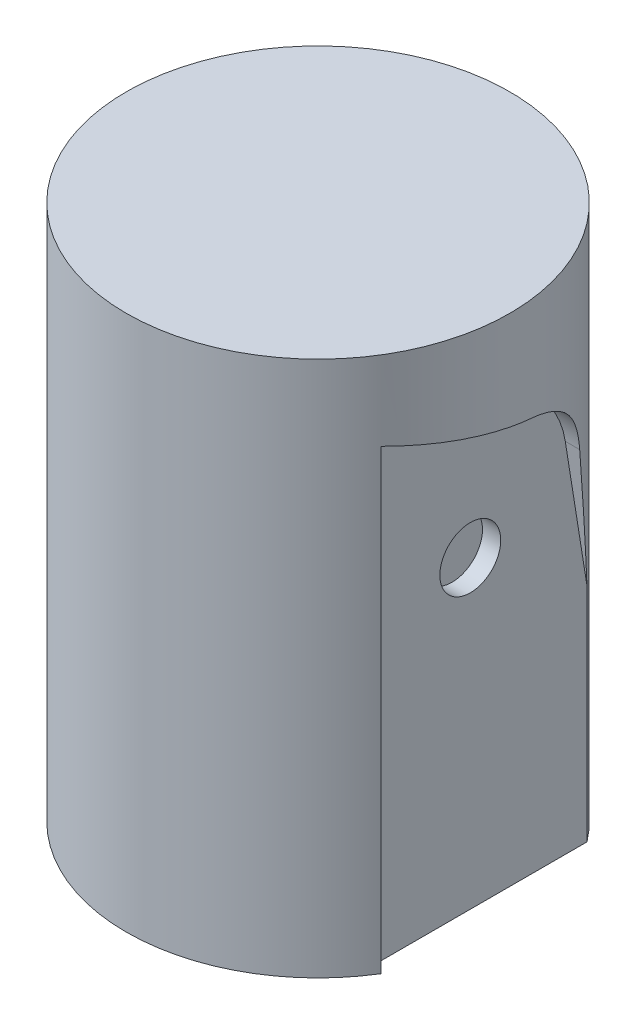
ISO-10303-21;
HEADER;
FILE_DESCRIPTION(('STEP AP214'),'2;1');
FILE_NAME('part.step','',(''),(''),'','','');
FILE_SCHEMA(('AUTOMOTIVE_DESIGN { 1 0 10303 214 1 1 1 1 }'));
ENDSEC;
DATA;
#1=APPLICATION_CONTEXT('core data for automotive mechanical design processes');
#2=APPLICATION_PROTOCOL_DEFINITION('international standard','automotive_design',2000,#1);
#3=PRODUCT_CONTEXT('',#1,'mechanical');
#4=PRODUCT('Part','Part','',(#3));
#5=PRODUCT_RELATED_PRODUCT_CATEGORY('part','',(#4));
#6=PRODUCT_DEFINITION_FORMATION('','',#4);
#7=PRODUCT_DEFINITION_CONTEXT('part definition',#1,'design');
#8=PRODUCT_DEFINITION('design','',#6,#7);
#9=PRODUCT_DEFINITION_SHAPE('','',#8);
#10=(LENGTH_UNIT() NAMED_UNIT(*) SI_UNIT(.MILLI.,.METRE.));
#11=(NAMED_UNIT(*) PLANE_ANGLE_UNIT() SI_UNIT($,.RADIAN.));
#12=(NAMED_UNIT(*) SI_UNIT($,.STERADIAN.) SOLID_ANGLE_UNIT());
#13=UNCERTAINTY_MEASURE_WITH_UNIT(LENGTH_MEASURE(1.E-05),#10,'distance_accuracy_value','');
#14=(GEOMETRIC_REPRESENTATION_CONTEXT(3) GLOBAL_UNCERTAINTY_ASSIGNED_CONTEXT((#13)) GLOBAL_UNIT_ASSIGNED_CONTEXT((#10,
#11,#12)) REPRESENTATION_CONTEXT('',''));
#15=CARTESIAN_POINT('',(0.,0.,0.));
#16=DIRECTION('',(0.,0.,1.));
#17=DIRECTION('',(1.,0.,0.));
#18=AXIS2_PLACEMENT_3D('',#15,#16,#17);
#19=CARTESIAN_POINT('',(0.,88.,0.));
#20=DIRECTION('',(0.,-1.,0.));
#21=DIRECTION('',(0.,0.,-1.));
#22=AXIS2_PLACEMENT_3D('',#19,#20,#21);
#23=CYLINDRICAL_SURFACE('',#22,31.5);
#24=CARTESIAN_POINT('',(0.,88.,0.));
#25=DIRECTION('',(0.,1.,0.));
#26=DIRECTION('',(0.,0.,1.));
#27=AXIS2_PLACEMENT_3D('',#24,#25,#26);
#28=CIRCLE('',#27,31.5);
#29=CARTESIAN_POINT('',(0.,88.,31.5));
#30=VERTEX_POINT('',#29);
#31=EDGE_CURVE('E182',#30,#30,#28,.T.);
#32=ORIENTED_EDGE('',*,*,#31,.F.);
#33=EDGE_LOOP('',(#32));
#34=FACE_BOUND('',#33,.T.);
#35=CARTESIAN_POINT('',(0.,71.8147338981739,0.));
#36=DIRECTION('',(0.,-0.981871682908393,0.18954682350976));
#37=DIRECTION('',(0.,-0.18954682350976,-0.981871682908393));
#38=AXIS2_PLACEMENT_3D('',#35,#36,#37);
#39=ELLIPSE('',#38,32.0815851483711,31.5);
#40=CARTESIAN_POINT('',(-26.8328157299975,75.,16.5));
#41=VERTEX_POINT('',#40);
#42=CARTESIAN_POINT('',(-31.2906872193314,71.1148801911761,-3.62531286125343));
#43=VERTEX_POINT('',#42);
#44=EDGE_CURVE('E229',#41,#43,#39,.T.);
#45=ORIENTED_EDGE('',*,*,#44,.F.);
#46=DIRECTION('',(0.,-1.,0.));
#47=VECTOR('',#46,1.);
#48=CARTESIAN_POINT('',(-26.8328157299975,88.,16.5));
#49=LINE('',#48,#47);
#50=CARTESIAN_POINT('',(-26.8328157299975,0.,16.5));
#51=VERTEX_POINT('',#50);
#52=EDGE_CURVE('E150',#51,#41,#49,.F.);
#53=ORIENTED_EDGE('',*,*,#52,.F.);
#54=CARTESIAN_POINT('',(0.,0.,0.));
#55=DIRECTION('',(0.,1.,0.));
#56=DIRECTION('',(0.,0.,1.));
#57=AXIS2_PLACEMENT_3D('',#54,#55,#56);
#58=CIRCLE('',#57,31.5);
#59=CARTESIAN_POINT('',(26.8328157299975,0.,16.5));
#60=VERTEX_POINT('',#59);
#61=EDGE_CURVE('E181',#51,#60,#58,.T.);
#62=ORIENTED_EDGE('',*,*,#61,.T.);
#63=DIRECTION('',(0.,-1.,0.));
#64=VECTOR('',#63,1.);
#65=CARTESIAN_POINT('',(26.8328157299975,88.,16.5));
#66=LINE('',#65,#64);
#67=CARTESIAN_POINT('',(26.8328157299975,75.,16.5));
#68=VERTEX_POINT('',#67);
#69=EDGE_CURVE('E178',#60,#68,#66,.F.);
#70=ORIENTED_EDGE('',*,*,#69,.T.);
#71=CARTESIAN_POINT('',(0.,71.8147338981739,0.));
#72=DIRECTION('',(0.,0.981871682908393,-0.18954682350976));
#73=DIRECTION('',(0.,-0.18954682350976,-0.981871682908393));
#74=AXIS2_PLACEMENT_3D('',#71,#72,#73);
#75=ELLIPSE('',#74,32.0815851483711,31.5);
#76=CARTESIAN_POINT('',(31.2906872193314,71.1148801911761,-3.62531286125343));
#77=VERTEX_POINT('',#76);
#78=EDGE_CURVE('E185',#68,#77,#75,.T.);
#79=ORIENTED_EDGE('',*,*,#78,.T.);
#80=CARTESIAN_POINT('',(31.2906872193314,71.1148801911761,-3.62531286125343));
#81=CARTESIAN_POINT('',(31.266842536933,71.0751463907167,-3.83114152227725));
#82=CARTESIAN_POINT('',(31.2410595370752,71.0311437537012,-4.03588845928856));
#83=CARTESIAN_POINT('',(31.185782107281,70.934744103389,-4.44287573801887));
#84=CARTESIAN_POINT('',(31.1562879318178,70.8823476655833,-4.64511625055852));
#85=CARTESIAN_POINT('',(31.062533168897,70.7128676345266,-5.24727119374336));
#86=CARTESIAN_POINT('',(30.9929600909044,70.5834266825377,-5.64296285645147));
#87=CARTESIAN_POINT('',(30.8416930606516,70.2937544090785,-6.41836673990311));
#88=CARTESIAN_POINT('',(30.7600537320041,70.133660932869,-6.79814155544458));
#89=CARTESIAN_POINT('',(30.5863277022694,69.783862584726,-7.54136627876883));
#90=CARTESIAN_POINT('',(30.4942395788485,69.5941536800925,-7.90481395461076));
#91=CARTESIAN_POINT('',(30.3019570911949,69.1872296375697,-8.61252454193126));
#92=CARTESIAN_POINT('',(30.2017816548888,68.9700780902188,-8.95682923745118));
#93=CARTESIAN_POINT('',(29.995385435423,68.5095173036784,-9.62544926388786));
#94=CARTESIAN_POINT('',(29.8891648174907,68.2661087819834,-9.94976514063603));
#95=CARTESIAN_POINT('',(29.6728347953608,67.7540780310457,-10.5774899733864));
#96=CARTESIAN_POINT('',(29.5627186981835,67.4854109466888,-10.8808600110924));
#97=CARTESIAN_POINT('',(29.3412497503065,66.9246818471142,-11.4646652908641));
#98=CARTESIAN_POINT('',(29.2298968589866,66.6326190615378,-11.7450997771077));
#99=CARTESIAN_POINT('',(29.0011625175355,66.0063391134324,-12.2995273884945));
#100=CARTESIAN_POINT('',(28.883872248467,65.6706103919869,-12.5718537559676));
#101=CARTESIAN_POINT('',(28.654031388408,64.9757885605561,-13.0872507701696));
#102=CARTESIAN_POINT('',(28.5414814199786,64.6166923973024,-13.3303175818738));
#103=CARTESIAN_POINT('',(28.3247062797781,63.8777635179582,-13.784930834639));
#104=CARTESIAN_POINT('',(28.2204643992338,63.4979751484809,-13.9965413210341));
#105=CARTESIAN_POINT('',(28.0234509458657,62.7191201848445,-14.3869395549198));
#106=CARTESIAN_POINT('',(27.9306750995408,62.3200608507514,-14.565739543317));
#107=CARTESIAN_POINT('',(27.7924095024678,61.6603448466249,-14.8271625947063));
#108=CARTESIAN_POINT('',(27.7423629963583,61.4048266334953,-14.9204882931399));
#109=CARTESIAN_POINT('',(27.6486756837974,60.888082302085,-15.0933890628347));
#110=CARTESIAN_POINT('',(27.6050330925959,60.6268577975349,-15.1729679663831));
#111=CARTESIAN_POINT('',(27.5247934632969,60.0991337098306,-15.3180507776835));
#112=CARTESIAN_POINT('',(27.4882044713676,59.8326284804059,-15.3835386212803));
#113=CARTESIAN_POINT('',(27.422706865806,59.2954050161384,-15.499981514527));
#114=CARTESIAN_POINT('',(27.3938017743803,59.0246849092279,-15.5509299002499));
#115=CARTESIAN_POINT('',(27.3690424110006,58.7523670831032,-15.594406609578));
#116=B_SPLINE_CURVE_WITH_KNOTS('',3,(#80,#81,#82,#83,#84,#85,#86,#87,#88,#89,#90,#91,#92,#93,
#94,#95,#96,#97,#98,#99,#100,#101,#102,#103,#104,#105,#106,#107,#108,#109,#110,#111,#112,#113,
#114,#115),.UNSPECIFIED.,.F.,.F.,(4,2,2,2,2,2,2,2,2,2,2,2,2,2,2,2,2,4),(0.,0.63282497430133,
1.26560657977216,2.5301160456606,3.78906714878028,5.04818983165283,6.30444659036796,
7.5606690294723,8.81916604351223,10.0777045135842,11.4198855905001,12.7622423948201,
14.1018275727852,15.4409119590866,16.2702742038842,17.0994048673234,17.929475810016,
18.7599265935946),.UNSPECIFIED.);
#117=CARTESIAN_POINT('',(27.3690424110006,58.7523670831032,-15.594406609578));
#118=VERTEX_POINT('',#117);
#119=EDGE_CURVE('E191',#77,#118,#116,.T.);
#120=ORIENTED_EDGE('',*,*,#119,.T.);
#121=CARTESIAN_POINT('',(0.,156.398911533728,0.));
#122=DIRECTION('',(0.,0.157704142370211,-0.987486406731392));
#123=DIRECTION('',(0.,-0.987486406731392,-0.157704142370211));
#124=AXIS2_PLACEMENT_3D('',#121,#122,#123);
#125=ELLIPSE('',#124,199.741107155281,31.5);
#126=CARTESIAN_POINT('',(25.,36.4023152784503,-19.1637678967368));
#127=VERTEX_POINT('',#126);
#128=EDGE_CURVE('E199',#118,#127,#125,.T.);
#129=ORIENTED_EDGE('',*,*,#128,.T.);
#130=DIRECTION('',(0.,-1.,0.));
#131=VECTOR('',#130,1.);
#132=CARTESIAN_POINT('',(25.,88.,-19.1637678967368));
#133=LINE('',#132,#131);
#134=CARTESIAN_POINT('',(25.,0.,-19.1637678967368));
#135=VERTEX_POINT('',#134);
#136=EDGE_CURVE('E167',#127,#135,#133,.T.);
#137=ORIENTED_EDGE('',*,*,#136,.T.);
#138=CARTESIAN_POINT('',(-25.,0.,-19.1637678967368));
#139=VERTEX_POINT('',#138);
#140=EDGE_CURVE('E186',#135,#139,#58,.T.);
#141=ORIENTED_EDGE('',*,*,#140,.T.);
#142=DIRECTION('',(0.,-1.,0.));
#143=VECTOR('',#142,1.);
#144=CARTESIAN_POINT('',(-25.,88.,-19.1637678967368));
#145=LINE('',#144,#143);
#146=CARTESIAN_POINT('',(-25.,36.4023152784503,-19.1637678967368));
#147=VERTEX_POINT('',#146);
#148=EDGE_CURVE('E49',#139,#147,#145,.F.);
#149=ORIENTED_EDGE('',*,*,#148,.T.);
#150=CARTESIAN_POINT('',(0.,156.398911533728,0.));
#151=DIRECTION('',(0.,-0.157704142370211,0.987486406731392));
#152=DIRECTION('',(0.,-0.987486406731392,-0.157704142370211));
#153=AXIS2_PLACEMENT_3D('',#150,#151,#152);
#154=ELLIPSE('',#153,199.741107155281,31.5);
#155=CARTESIAN_POINT('',(-27.3690424110006,58.7523670831032,-15.594406609578));
#156=VERTEX_POINT('',#155);
#157=EDGE_CURVE('E11',#156,#147,#154,.T.);
#158=ORIENTED_EDGE('',*,*,#157,.F.);
#159=CARTESIAN_POINT('',(-31.2906872193314,71.1148801911761,-3.62531286125343));
#160=CARTESIAN_POINT('',(-31.266842536933,71.0751463907167,-3.83114152227725));
#161=CARTESIAN_POINT('',(-31.2410595370752,71.0311437537012,-4.03588845928856));
#162=CARTESIAN_POINT('',(-31.185782107281,70.934744103389,-4.44287573801887));
#163=CARTESIAN_POINT('',(-31.1562879318178,70.8823476655833,-4.64511625055852));
#164=CARTESIAN_POINT('',(-31.062533168897,70.7128676345266,-5.24727119374337));
#165=CARTESIAN_POINT('',(-30.9929600909044,70.5834266825377,-5.64296285645148));
#166=CARTESIAN_POINT('',(-30.8416930606516,70.2937544090785,-6.41836673990312));
#167=CARTESIAN_POINT('',(-30.7600537320041,70.133660932869,-6.79814155544459));
#168=CARTESIAN_POINT('',(-30.5863277022694,69.783862584726,-7.54136627876883));
#169=CARTESIAN_POINT('',(-30.4942395788485,69.5941536800925,-7.90481395461077));
#170=CARTESIAN_POINT('',(-30.301957091195,69.1872296375697,-8.61252454193127));
#171=CARTESIAN_POINT('',(-30.2017816548888,68.9700780902188,-8.95682923745119));
#172=CARTESIAN_POINT('',(-29.995385435423,68.5095173036784,-9.62544926388786));
#173=CARTESIAN_POINT('',(-29.8891648174906,68.2661087819834,-9.94976514063603));
#174=CARTESIAN_POINT('',(-29.6728347953608,67.7540780310457,-10.5774899733864));
#175=CARTESIAN_POINT('',(-29.5627186981835,67.4854109466888,-10.8808600110924));
#176=CARTESIAN_POINT('',(-29.3412497503065,66.9246818471142,-11.4646652908641));
#177=CARTESIAN_POINT('',(-29.2298968589866,66.6326190615378,-11.7450997771077));
#178=CARTESIAN_POINT('',(-29.0011625175356,66.0063391134324,-12.2995273884945));
#179=CARTESIAN_POINT('',(-28.883872248467,65.6706103919869,-12.5718537559676));
#180=CARTESIAN_POINT('',(-28.654031388408,64.9757885605561,-13.0872507701696));
#181=CARTESIAN_POINT('',(-28.5414814199786,64.6166923973024,-13.3303175818738));
#182=CARTESIAN_POINT('',(-28.3247062797781,63.8777635179582,-13.784930834639));
#183=CARTESIAN_POINT('',(-28.2204643992338,63.4979751484809,-13.9965413210341));
#184=CARTESIAN_POINT('',(-28.0234509458656,62.7191201848445,-14.3869395549198));
#185=CARTESIAN_POINT('',(-27.9306750995408,62.3200608507514,-14.565739543317));
#186=CARTESIAN_POINT('',(-27.7924095024678,61.6603448466249,-14.8271625947063));
#187=CARTESIAN_POINT('',(-27.7423629963583,61.4048266334953,-14.9204882931399));
#188=CARTESIAN_POINT('',(-27.6486756837974,60.888082302085,-15.0933890628347));
#189=CARTESIAN_POINT('',(-27.6050330925959,60.6268577975349,-15.1729679663831));
#190=CARTESIAN_POINT('',(-27.5247934632969,60.0991337098306,-15.3180507776835));
#191=CARTESIAN_POINT('',(-27.4882044713676,59.8326284804059,-15.3835386212803));
#192=CARTESIAN_POINT('',(-27.422706865806,59.2954050161384,-15.499981514527));
#193=CARTESIAN_POINT('',(-27.3938017743803,59.0246849092279,-15.5509299002499));
#194=CARTESIAN_POINT('',(-27.3690424110006,58.7523670831032,-15.594406609578));
#195=B_SPLINE_CURVE_WITH_KNOTS('',3,(#159,#160,#161,#162,#163,#164,#165,#166,#167,#168,#169,
#170,#171,#172,#173,#174,#175,#176,#177,#178,#179,#180,#181,#182,#183,#184,#185,#186,#187,#188,
#189,#190,#191,#192,#193,#194),.UNSPECIFIED.,.F.,.F.,(4,2,2,2,2,2,2,2,2,2,2,2,2,2,2,2,2,4),(0.,
0.63282497430133,1.26560657977216,2.53011604566061,3.78906714878029,5.04818983165284,
6.30444659036795,7.5606690294723,8.81916604351224,10.0777045135842,11.4198855905002,
12.7622423948202,14.1018275727852,15.4409119590866,16.2702742038842,17.0994048673234,
17.929475810016,18.7599265935946),.UNSPECIFIED.);
#196=EDGE_CURVE('E42',#43,#156,#195,.T.);
#197=ORIENTED_EDGE('',*,*,#196,.F.);
#198=EDGE_LOOP('',(#45,#53,#62,#70,#79,#120,#129,#137,#141,#149,#158,#197));
#199=FACE_BOUND('',#198,.T.);
#200=ADVANCED_FACE('F34',(#34,#199),#23,.T.);
#201=CARTESIAN_POINT('',(0.,0.,0.));
#202=DIRECTION('',(0.,1.,0.));
#203=DIRECTION('',(0.,0.,1.));
#204=AXIS2_PLACEMENT_3D('',#201,#202,#203);
#205=PLANE('',#204);
#206=DIRECTION('',(-1.,0.,0.));
#207=VECTOR('',#206,1.);
#208=CARTESIAN_POINT('',(-25.,0.,16.5));
#209=LINE('',#208,#207);
#210=CARTESIAN_POINT('',(-25.,0.,16.5));
#211=VERTEX_POINT('',#210);
#212=EDGE_CURVE('E127',#211,#51,#209,.T.);
#213=ORIENTED_EDGE('',*,*,#212,.F.);
#214=DIRECTION('',(0.,0.,-1.));
#215=VECTOR('',#214,1.);
#216=CARTESIAN_POINT('',(-25.,0.,-24.977312136075));
#217=LINE('',#216,#215);
#218=EDGE_CURVE('E118',#211,#139,#217,.T.);
#219=ORIENTED_EDGE('',*,*,#218,.T.);
#220=ORIENTED_EDGE('',*,*,#140,.F.);
#221=DIRECTION('',(0.,0.,-1.));
#222=VECTOR('',#221,1.);
#223=CARTESIAN_POINT('',(25.,0.,-24.977312136075));
#224=LINE('',#223,#222);
#225=CARTESIAN_POINT('',(25.,0.,16.5));
#226=VERTEX_POINT('',#225);
#227=EDGE_CURVE('E159',#226,#135,#224,.T.);
#228=ORIENTED_EDGE('',*,*,#227,.F.);
#229=DIRECTION('',(1.,0.,0.));
#230=VECTOR('',#229,1.);
#231=CARTESIAN_POINT('',(25.,0.,16.5));
#232=LINE('',#231,#230);
#233=EDGE_CURVE('E168',#226,#60,#232,.T.);
#234=ORIENTED_EDGE('',*,*,#233,.T.);
#235=ORIENTED_EDGE('',*,*,#61,.F.);
#236=EDGE_LOOP('',(#213,#219,#220,#228,#234,#235));
#237=FACE_BOUND('',#236,.T.);
#238=ADVANCED_FACE('F212',(#237),#205,.F.);
#239=CARTESIAN_POINT('',(0.,88.,0.));
#240=DIRECTION('',(0.,1.,0.));
#241=DIRECTION('',(0.,0.,1.));
#242=AXIS2_PLACEMENT_3D('',#239,#240,#241);
#243=PLANE('',#242);
#244=ORIENTED_EDGE('',*,*,#31,.T.);
#245=EDGE_LOOP('',(#244));
#246=FACE_BOUND('',#245,.T.);
#247=ADVANCED_FACE('F207',(#246),#243,.T.);
#248=CARTESIAN_POINT('',(25.,56.3868049475501,-0.782110508607116));
#249=DIRECTION('',(1.,0.,0.));
#250=DIRECTION('',(0.,0.,-1.));
#251=AXIS2_PLACEMENT_3D('',#248,#249,#250);
#252=CYLINDRICAL_SURFACE('',#251,15.);
#253=DIRECTION('',(1.,0.,0.));
#254=VECTOR('',#253,1.);
#255=CARTESIAN_POINT('',(25.,71.1148801911761,-3.62531286125343));
#256=LINE('',#255,#254);
#257=CARTESIAN_POINT('',(25.,71.1148801911761,-3.62531286125343));
#258=VERTEX_POINT('',#257);
#259=EDGE_CURVE('E163',#258,#77,#256,.T.);
#260=ORIENTED_EDGE('',*,*,#259,.F.);
#261=CARTESIAN_POINT('',(25.,56.3868049475501,-0.782110508607116));
#262=DIRECTION('',(1.,0.,0.));
#263=DIRECTION('',(0.,0.,1.));
#264=AXIS2_PLACEMENT_3D('',#261,#262,#263);
#265=CIRCLE('',#264,15.);
#266=CARTESIAN_POINT('',(25.,58.7523670831032,-15.594406609578));
#267=VERTEX_POINT('',#266);
#268=EDGE_CURVE('E153',#267,#258,#265,.T.);
#269=ORIENTED_EDGE('',*,*,#268,.F.);
#270=DIRECTION('',(1.,0.,0.));
#271=VECTOR('',#270,1.);
#272=CARTESIAN_POINT('',(25.,58.7523670831032,-15.594406609578));
#273=LINE('',#272,#271);
#274=EDGE_CURVE('E164',#267,#118,#273,.T.);
#275=ORIENTED_EDGE('',*,*,#274,.T.);
#276=ORIENTED_EDGE('',*,*,#119,.F.);
#277=EDGE_LOOP('',(#260,#269,#275,#276));
#278=FACE_BOUND('',#277,.T.);
#279=ADVANCED_FACE('F201',(#278),#252,.F.);
#280=CARTESIAN_POINT('',(25.,58.7523670831032,-15.594406609578));
#281=DIRECTION('',(0.,0.157704142370211,-0.987486406731392));
#282=DIRECTION('',(0.,0.987486406731392,0.157704142370211));
#283=AXIS2_PLACEMENT_3D('',#280,#281,#282);
#284=PLANE('',#283);
#285=ORIENTED_EDGE('',*,*,#274,.F.);
#286=DIRECTION('',(0.,0.987486406731392,0.157704142370211));
#287=VECTOR('',#286,1.);
#288=CARTESIAN_POINT('',(25.,58.7523670831032,-15.594406609578));
#289=LINE('',#288,#287);
#290=EDGE_CURVE('E161',#127,#267,#289,.T.);
#291=ORIENTED_EDGE('',*,*,#290,.F.);
#292=ORIENTED_EDGE('',*,*,#128,.F.);
#293=EDGE_LOOP('',(#285,#291,#292));
#294=FACE_BOUND('',#293,.T.);
#295=ADVANCED_FACE('F206',(#294),#284,.F.);
#296=CARTESIAN_POINT('',(25.,75.,16.5));
#297=DIRECTION('',(0.,0.981871682908393,-0.18954682350976));
#298=DIRECTION('',(0.,0.18954682350976,0.981871682908393));
#299=AXIS2_PLACEMENT_3D('',#296,#297,#298);
#300=PLANE('',#299);
#301=DIRECTION('',(1.,0.,0.));
#302=VECTOR('',#301,1.);
#303=CARTESIAN_POINT('',(25.,75.,16.5));
#304=LINE('',#303,#302);
#305=CARTESIAN_POINT('',(25.,75.,16.5));
#306=VERTEX_POINT('',#305);
#307=EDGE_CURVE('E171',#306,#68,#304,.T.);
#308=ORIENTED_EDGE('',*,*,#307,.F.);
#309=DIRECTION('',(0.,0.18954682350976,0.981871682908393));
#310=VECTOR('',#309,1.);
#311=CARTESIAN_POINT('',(25.,75.,16.5));
#312=LINE('',#311,#310);
#313=EDGE_CURVE('E156',#258,#306,#312,.T.);
#314=ORIENTED_EDGE('',*,*,#313,.F.);
#315=ORIENTED_EDGE('',*,*,#259,.T.);
#316=ORIENTED_EDGE('',*,*,#78,.F.);
#317=EDGE_LOOP('',(#308,#314,#315,#316));
#318=FACE_BOUND('',#317,.T.);
#319=ADVANCED_FACE('F209',(#318),#300,.F.);
#320=CARTESIAN_POINT('',(25.,0.,16.5));
#321=DIRECTION('',(0.,0.,1.));
#322=DIRECTION('',(1.,0.,0.));
#323=AXIS2_PLACEMENT_3D('',#320,#321,#322);
#324=PLANE('',#323);
#325=ORIENTED_EDGE('',*,*,#233,.F.);
#326=DIRECTION('',(0.,-1.,0.));
#327=VECTOR('',#326,1.);
#328=CARTESIAN_POINT('',(25.,0.,16.5));
#329=LINE('',#328,#327);
#330=EDGE_CURVE('E57',#306,#226,#329,.T.);
#331=ORIENTED_EDGE('',*,*,#330,.F.);
#332=ORIENTED_EDGE('',*,*,#307,.T.);
#333=ORIENTED_EDGE('',*,*,#69,.F.);
#334=EDGE_LOOP('',(#325,#331,#332,#333));
#335=FACE_BOUND('',#334,.T.);
#336=ADVANCED_FACE('F246',(#335),#324,.F.);
#337=CARTESIAN_POINT('',(25.,56.3868049475501,-0.782110508607116));
#338=DIRECTION('',(-1.,0.,0.));
#339=DIRECTION('',(0.,0.,1.));
#340=AXIS2_PLACEMENT_3D('',#337,#338,#339);
#341=PLANE('',#340);
#342=CARTESIAN_POINT('',(25.,50.,0.));
#343=DIRECTION('',(1.,0.,0.));
#344=DIRECTION('',(0.,0.,-1.));
#345=AXIS2_PLACEMENT_3D('',#342,#343,#344);
#346=CIRCLE('',#345,5.);
#347=CARTESIAN_POINT('',(25.,50.,-5.));
#348=VERTEX_POINT('',#347);
#349=EDGE_CURVE('E135',#348,#348,#346,.T.);
#350=ORIENTED_EDGE('',*,*,#349,.F.);
#351=EDGE_LOOP('',(#350));
#352=FACE_BOUND('',#351,.T.);
#353=ORIENTED_EDGE('',*,*,#290,.T.);
#354=ORIENTED_EDGE('',*,*,#268,.T.);
#355=ORIENTED_EDGE('',*,*,#313,.T.);
#356=ORIENTED_EDGE('',*,*,#330,.T.);
#357=ORIENTED_EDGE('',*,*,#227,.T.);
#358=ORIENTED_EDGE('',*,*,#136,.F.);
#359=EDGE_LOOP('',(#353,#354,#355,#356,#357,#358));
#360=FACE_BOUND('',#359,.T.);
#361=ADVANCED_FACE('F242',(#352,#360),#341,.F.);
#362=CARTESIAN_POINT('',(-25.,56.3868049475501,-0.782110508607116));
#363=DIRECTION('',(-1.,0.,0.));
#364=DIRECTION('',(0.,0.,1.));
#365=AXIS2_PLACEMENT_3D('',#362,#363,#364);
#366=CYLINDRICAL_SURFACE('',#365,15.);
#367=ORIENTED_EDGE('',*,*,#196,.T.);
#368=DIRECTION('',(-1.,0.,0.));
#369=VECTOR('',#368,1.);
#370=CARTESIAN_POINT('',(-25.,58.7523670831032,-15.594406609578));
#371=LINE('',#370,#369);
#372=CARTESIAN_POINT('',(-25.,58.7523670831032,-15.594406609578));
#373=VERTEX_POINT('',#372);
#374=EDGE_CURVE('E115',#373,#156,#371,.T.);
#375=ORIENTED_EDGE('',*,*,#374,.F.);
#376=CARTESIAN_POINT('',(-25.,56.3868049475501,-0.782110508607116));
#377=DIRECTION('',(1.,0.,0.));
#378=DIRECTION('',(0.,0.,1.));
#379=AXIS2_PLACEMENT_3D('',#376,#377,#378);
#380=CIRCLE('',#379,15.);
#381=CARTESIAN_POINT('',(-25.,71.1148801911761,-3.62531286125343));
#382=VERTEX_POINT('',#381);
#383=EDGE_CURVE('E119',#373,#382,#380,.T.);
#384=ORIENTED_EDGE('',*,*,#383,.T.);
#385=DIRECTION('',(-1.,0.,0.));
#386=VECTOR('',#385,1.);
#387=CARTESIAN_POINT('',(-25.,71.1148801911761,-3.62531286125343));
#388=LINE('',#387,#386);
#389=EDGE_CURVE('E143',#382,#43,#388,.T.);
#390=ORIENTED_EDGE('',*,*,#389,.T.);
#391=EDGE_LOOP('',(#367,#375,#384,#390));
#392=FACE_BOUND('',#391,.T.);
#393=ADVANCED_FACE('F123',(#392),#366,.F.);
#394=CARTESIAN_POINT('',(-25.,75.,16.5));
#395=DIRECTION('',(0.,-0.981871682908393,0.18954682350976));
#396=DIRECTION('',(0.,-0.18954682350976,-0.981871682908393));
#397=AXIS2_PLACEMENT_3D('',#394,#395,#396);
#398=PLANE('',#397);
#399=DIRECTION('',(-1.,0.,0.));
#400=VECTOR('',#399,1.);
#401=CARTESIAN_POINT('',(-25.,75.,16.5));
#402=LINE('',#401,#400);
#403=CARTESIAN_POINT('',(-25.,75.,16.5));
#404=VERTEX_POINT('',#403);
#405=EDGE_CURVE('E145',#404,#41,#402,.T.);
#406=ORIENTED_EDGE('',*,*,#405,.T.);
#407=ORIENTED_EDGE('',*,*,#44,.T.);
#408=ORIENTED_EDGE('',*,*,#389,.F.);
#409=DIRECTION('',(0.,0.18954682350976,0.981871682908393));
#410=VECTOR('',#409,1.);
#411=CARTESIAN_POINT('',(-25.,75.,16.5));
#412=LINE('',#411,#410);
#413=EDGE_CURVE('E128',#382,#404,#412,.T.);
#414=ORIENTED_EDGE('',*,*,#413,.T.);
#415=EDGE_LOOP('',(#406,#407,#408,#414));
#416=FACE_BOUND('',#415,.T.);
#417=ADVANCED_FACE('F241',(#416),#398,.T.);
#418=CARTESIAN_POINT('',(-25.,58.7523670831032,-15.594406609578));
#419=DIRECTION('',(0.,-0.157704142370211,0.987486406731392));
#420=DIRECTION('',(0.,-0.987486406731392,-0.157704142370211));
#421=AXIS2_PLACEMENT_3D('',#418,#419,#420);
#422=PLANE('',#421);
#423=ORIENTED_EDGE('',*,*,#157,.T.);
#424=DIRECTION('',(0.,0.987486406731392,0.157704142370211));
#425=VECTOR('',#424,1.);
#426=CARTESIAN_POINT('',(-25.,58.7523670831032,-15.594406609578));
#427=LINE('',#426,#425);
#428=EDGE_CURVE('E112',#147,#373,#427,.T.);
#429=ORIENTED_EDGE('',*,*,#428,.T.);
#430=ORIENTED_EDGE('',*,*,#374,.T.);
#431=EDGE_LOOP('',(#423,#429,#430));
#432=FACE_BOUND('',#431,.T.);
#433=ADVANCED_FACE('F114',(#432),#422,.T.);
#434=CARTESIAN_POINT('',(-25.,0.,16.5));
#435=DIRECTION('',(0.,0.,-1.));
#436=DIRECTION('',(-1.,0.,0.));
#437=AXIS2_PLACEMENT_3D('',#434,#435,#436);
#438=PLANE('',#437);
#439=ORIENTED_EDGE('',*,*,#52,.T.);
#440=ORIENTED_EDGE('',*,*,#405,.F.);
#441=DIRECTION('',(0.,-1.,0.));
#442=VECTOR('',#441,1.);
#443=CARTESIAN_POINT('',(-25.,0.,16.5));
#444=LINE('',#443,#442);
#445=EDGE_CURVE('E140',#404,#211,#444,.T.);
#446=ORIENTED_EDGE('',*,*,#445,.T.);
#447=ORIENTED_EDGE('',*,*,#212,.T.);
#448=EDGE_LOOP('',(#439,#440,#446,#447));
#449=FACE_BOUND('',#448,.T.);
#450=ADVANCED_FACE('F225',(#449),#438,.T.);
#451=CARTESIAN_POINT('',(-25.,56.3868049475501,-0.782110508607116));
#452=DIRECTION('',(1.,0.,0.));
#453=DIRECTION('',(0.,0.,1.));
#454=AXIS2_PLACEMENT_3D('',#451,#452,#453);
#455=PLANE('',#454);
#456=CARTESIAN_POINT('',(-25.,50.,0.));
#457=DIRECTION('',(1.,0.,0.));
#458=DIRECTION('',(0.,0.,-1.));
#459=AXIS2_PLACEMENT_3D('',#456,#457,#458);
#460=CIRCLE('',#459,5.);
#461=CARTESIAN_POINT('',(-25.,50.,-5.));
#462=VERTEX_POINT('',#461);
#463=EDGE_CURVE('E384',#462,#462,#460,.T.);
#464=ORIENTED_EDGE('',*,*,#463,.T.);
#465=EDGE_LOOP('',(#464));
#466=FACE_BOUND('',#465,.T.);
#467=ORIENTED_EDGE('',*,*,#218,.F.);
#468=ORIENTED_EDGE('',*,*,#445,.F.);
#469=ORIENTED_EDGE('',*,*,#413,.F.);
#470=ORIENTED_EDGE('',*,*,#383,.F.);
#471=ORIENTED_EDGE('',*,*,#428,.F.);
#472=ORIENTED_EDGE('',*,*,#148,.F.);
#473=EDGE_LOOP('',(#467,#468,#469,#470,#471,#472));
#474=FACE_BOUND('',#473,.T.);
#475=ADVANCED_FACE('F130',(#466,#474),#455,.F.);
#476=CARTESIAN_POINT('',(22.,50.,0.));
#477=DIRECTION('',(1.,0.,0.));
#478=DIRECTION('',(0.,0.,-1.));
#479=AXIS2_PLACEMENT_3D('',#476,#477,#478);
#480=CYLINDRICAL_SURFACE('',#479,5.);
#481=CARTESIAN_POINT('',(22.,50.,0.));
#482=DIRECTION('',(1.,0.,0.));
#483=DIRECTION('',(0.,0.,-1.));
#484=AXIS2_PLACEMENT_3D('',#481,#482,#483);
#485=CIRCLE('',#484,5.);
#486=CARTESIAN_POINT('',(22.,50.,-5.));
#487=VERTEX_POINT('',#486);
#488=EDGE_CURVE('E132',#487,#487,#485,.T.);
#489=ORIENTED_EDGE('',*,*,#488,.F.);
#490=EDGE_LOOP('',(#489));
#491=FACE_BOUND('',#490,.T.);
#492=ORIENTED_EDGE('',*,*,#349,.T.);
#493=EDGE_LOOP('',(#492));
#494=FACE_BOUND('',#493,.T.);
#495=ADVANCED_FACE('F334',(#491,#494),#480,.F.);
#496=CARTESIAN_POINT('',(22.,50.,0.));
#497=DIRECTION('',(1.,0.,0.));
#498=DIRECTION('',(0.,0.,-1.));
#499=AXIS2_PLACEMENT_3D('',#496,#497,#498);
#500=PLANE('',#499);
#501=ORIENTED_EDGE('',*,*,#488,.T.);
#502=EDGE_LOOP('',(#501));
#503=FACE_BOUND('',#502,.T.);
#504=ADVANCED_FACE('F344',(#503),#500,.T.);
#505=CARTESIAN_POINT('',(-22.,50.,0.));
#506=DIRECTION('',(-1.,0.,0.));
#507=DIRECTION('',(0.,0.,1.));
#508=AXIS2_PLACEMENT_3D('',#505,#506,#507);
#509=CYLINDRICAL_SURFACE('',#508,5.);
#510=CARTESIAN_POINT('',(-22.,50.,0.));
#511=DIRECTION('',(1.,0.,0.));
#512=DIRECTION('',(0.,0.,-1.));
#513=AXIS2_PLACEMENT_3D('',#510,#511,#512);
#514=CIRCLE('',#513,5.);
#515=CARTESIAN_POINT('',(-22.,50.,-5.));
#516=VERTEX_POINT('',#515);
#517=EDGE_CURVE('E383',#516,#516,#514,.T.);
#518=ORIENTED_EDGE('',*,*,#517,.T.);
#519=EDGE_LOOP('',(#518));
#520=FACE_BOUND('',#519,.T.);
#521=ORIENTED_EDGE('',*,*,#463,.F.);
#522=EDGE_LOOP('',(#521));
#523=FACE_BOUND('',#522,.T.);
#524=ADVANCED_FACE('F352',(#520,#523),#509,.F.);
#525=CARTESIAN_POINT('',(-22.,50.,0.));
#526=DIRECTION('',(-1.,0.,0.));
#527=DIRECTION('',(0.,0.,-1.));
#528=AXIS2_PLACEMENT_3D('',#525,#526,#527);
#529=PLANE('',#528);
#530=ORIENTED_EDGE('',*,*,#517,.F.);
#531=EDGE_LOOP('',(#530));
#532=FACE_BOUND('',#531,.T.);
#533=ADVANCED_FACE('F360',(#532),#529,.T.);
#534=CLOSED_SHELL('',(#200,#238,#247,#279,#295,#319,#336,#361,#393,#417,#433,#450,#475,#495,
#504,#524,#533));
#535=MANIFOLD_SOLID_BREP('B2',#534);
#536=ADVANCED_BREP_SHAPE_REPRESENTATION('',(#18,#535),#14);
#537=SHAPE_DEFINITION_REPRESENTATION(#9,#536);
ENDSEC;
END-ISO-10303-21;
